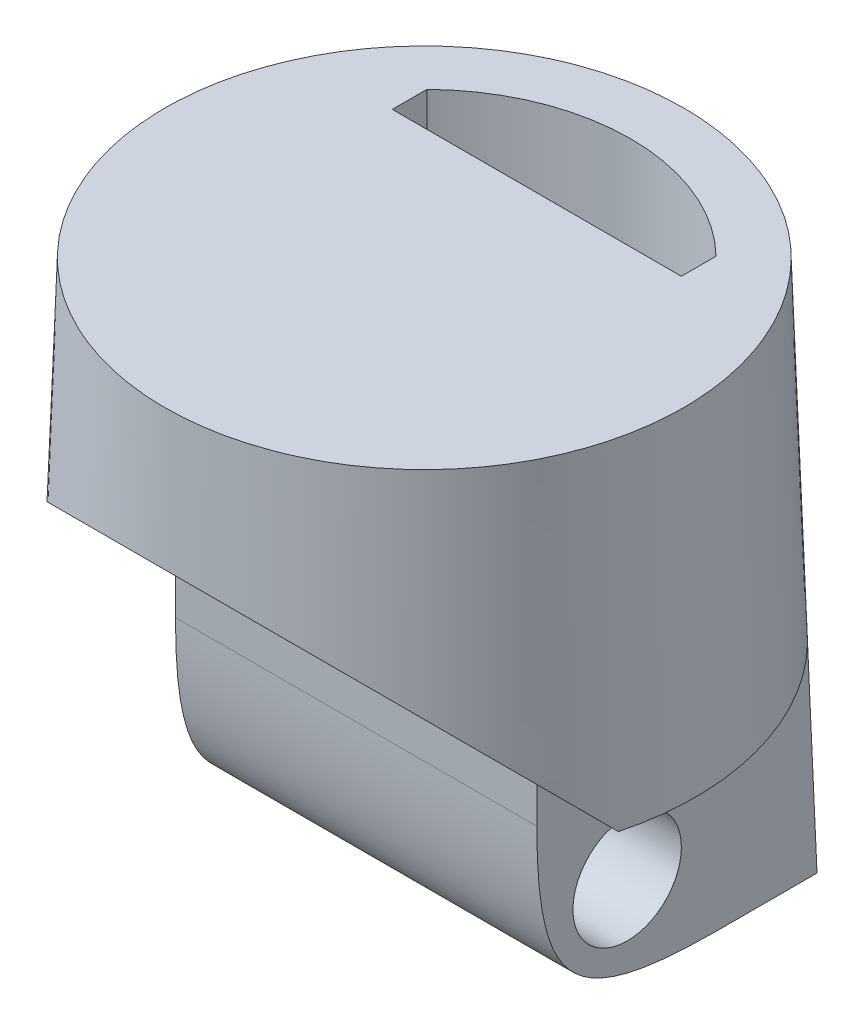
ISO-10303-21;
HEADER;
FILE_DESCRIPTION(('STEP AP214'),'2;1');
FILE_NAME('part.step','',(''),(''),'','','');
FILE_SCHEMA(('AUTOMOTIVE_DESIGN { 1 0 10303 214 1 1 1 1 }'));
ENDSEC;
DATA;
#1=APPLICATION_CONTEXT('core data for automotive mechanical design processes');
#2=APPLICATION_PROTOCOL_DEFINITION('international standard','automotive_design',2000,#1);
#3=PRODUCT_CONTEXT('',#1,'mechanical');
#4=PRODUCT('Part','Part','',(#3));
#5=PRODUCT_RELATED_PRODUCT_CATEGORY('part','',(#4));
#6=PRODUCT_DEFINITION_FORMATION('','',#4);
#7=PRODUCT_DEFINITION_CONTEXT('part definition',#1,'design');
#8=PRODUCT_DEFINITION('design','',#6,#7);
#9=PRODUCT_DEFINITION_SHAPE('','',#8);
#10=(LENGTH_UNIT() NAMED_UNIT(*) SI_UNIT(.MILLI.,.METRE.));
#11=(NAMED_UNIT(*) PLANE_ANGLE_UNIT() SI_UNIT($,.RADIAN.));
#12=(NAMED_UNIT(*) SI_UNIT($,.STERADIAN.) SOLID_ANGLE_UNIT());
#13=UNCERTAINTY_MEASURE_WITH_UNIT(LENGTH_MEASURE(1.E-05),#10,'distance_accuracy_value','');
#14=(GEOMETRIC_REPRESENTATION_CONTEXT(3) GLOBAL_UNCERTAINTY_ASSIGNED_CONTEXT((#13)) GLOBAL_UNIT_ASSIGNED_CONTEXT((#10,
#11,#12)) REPRESENTATION_CONTEXT('',''));
#15=CARTESIAN_POINT('',(0.,0.,0.));
#16=DIRECTION('',(0.,0.,1.));
#17=DIRECTION('',(1.,0.,0.));
#18=AXIS2_PLACEMENT_3D('',#15,#16,#17);
#19=CARTESIAN_POINT('',(0.,0.,0.));
#20=DIRECTION('',(0.,-1.,0.));
#21=DIRECTION('',(0.,0.,1.));
#22=AXIS2_PLACEMENT_3D('',#19,#20,#21);
#23=CONICAL_SURFACE('',#22,7.5,0.0349065850398867);
#24=CARTESIAN_POINT('',(0.,9.17972052923557,7.17943660421114));
#25=CARTESIAN_POINT('',(0.118571986620422,9.17972052923557,7.17944575688096));
#26=CARTESIAN_POINT('',(0.237150148904461,9.17972052923557,7.17661159384998));
#27=CARTESIAN_POINT('',(0.473168276274172,9.17972052923557,7.16520025098081));
#28=CARTESIAN_POINT('',(0.590610266603891,9.17972052923557,7.15666479635592));
#29=CARTESIAN_POINT('',(0.824357588198075,9.17972052923557,7.13385306660413));
#30=CARTESIAN_POINT('',(0.940665669416341,9.17972052923557,7.11960507988348));
#31=CARTESIAN_POINT('',(1.17214373783034,9.17972052923557,7.08538503356702));
#32=CARTESIAN_POINT('',(1.28731582557105,9.17972052923557,7.06542718945532));
#33=CARTESIAN_POINT('',(1.51652306444661,9.17972052923557,7.01980095339681));
#34=CARTESIAN_POINT('',(1.63055821826484,9.17972052923557,6.99413257493124));
#35=CARTESIAN_POINT('',(1.85749383923273,9.17972052923557,6.93709979430193));
#36=CARTESIAN_POINT('',(1.97039080849767,9.17972052923557,6.90572148122746));
#37=CARTESIAN_POINT('',(2.19505402212736,9.17972052923557,6.83728255298423));
#38=CARTESIAN_POINT('',(2.30681198965208,9.17972052923557,6.80019478638637));
#39=CARTESIAN_POINT('',(2.52920149877125,9.17972052923557,6.72035035257049));
#40=CARTESIAN_POINT('',(2.63981889533839,9.17972052923557,6.67755434103237));
#41=CARTESIAN_POINT('',(2.85877066945721,9.17972052923557,6.58678704588119));
#42=CARTESIAN_POINT('',(2.96710736633239,9.17972052923557,6.53882135688651));
#43=CARTESIAN_POINT('',(3.18053785662165,9.17972052923557,6.4380215445995));
#44=CARTESIAN_POINT('',(3.28564942473153,9.17972052923557,6.38522509945655));
#45=CARTESIAN_POINT('',(3.49263214894268,9.17972052923557,6.27477676203941));
#46=CARTESIAN_POINT('',(3.59451662054921,9.17972052923557,6.21714983491524));
#47=CARTESIAN_POINT('',(3.79505015521465,9.17972052923557,6.09705342613454));
#48=CARTESIAN_POINT('',(3.89370657193165,9.17972052923557,6.03459622674424));
#49=CARTESIAN_POINT('',(4.08779023357298,9.17972052923557,5.9048520841139));
#50=CARTESIAN_POINT('',(4.18321749018605,9.17972052923557,5.83756515835898));
#51=CARTESIAN_POINT('',(4.37085043104281,9.17972052923557,5.69817384818337));
#52=CARTESIAN_POINT('',(4.46304760184633,9.17972052923557,5.62605800677962));
#53=CARTESIAN_POINT('',(4.64422924545667,9.17972052923557,5.47702003453976));
#54=CARTESIAN_POINT('',(4.73319576502738,9.17972052923557,5.40007608701432));
#55=CARTESIAN_POINT('',(4.90792516029448,9.17972052923557,5.2413925823977));
#56=CARTESIAN_POINT('',(4.99366004006575,9.17972052923557,5.15962222524138));
#57=CARTESIAN_POINT('',(5.16109139933468,9.17972052923557,4.99213934443687));
#58=CARTESIAN_POINT('',(5.24279014095672,9.17972052923557,4.90642908219755));
#59=CARTESIAN_POINT('',(5.40133520247751,9.17972052923557,4.73175393581947));
#60=CARTESIAN_POINT('',(5.47821227196413,9.17972052923557,4.64281698610851));
#61=CARTESIAN_POINT('',(5.62712125139827,9.17972052923557,4.46169948007634));
#62=CARTESIAN_POINT('',(5.69917494569587,9.17972052923557,4.36953684117684));
#63=CARTESIAN_POINT('',(5.83844670867451,9.17972052923557,4.18197793297614));
#64=CARTESIAN_POINT('',(5.90567622418996,9.17972052923557,4.08659016563577));
#65=CARTESIAN_POINT('',(6.03531026796964,9.17972052923557,3.89259042754518));
#66=CARTESIAN_POINT('',(6.09771479408689,9.17972052923557,3.79397845536029));
#67=CARTESIAN_POINT('',(6.21771055747554,9.17972052923557,3.59353873415331));
#68=CARTESIAN_POINT('',(6.27528955546774,9.17972052923557,3.49170365991481));
#69=CARTESIAN_POINT('',(6.38564668703645,9.17972052923557,3.28482463393058));
#70=CARTESIAN_POINT('',(6.43839992684702,9.17972052923557,3.17976740907891));
#71=CARTESIAN_POINT('',(6.53911803043368,9.17972052923557,2.96645050906933));
#72=CARTESIAN_POINT('',(6.58704531596966,9.17972052923557,2.85817311113509));
#73=CARTESIAN_POINT('',(6.67769042035987,9.17972052923557,2.63946506813732));
#74=CARTESIAN_POINT('',(6.72040847723779,9.17972052923557,2.52903452172457));
#75=CARTESIAN_POINT('',(6.80011682634982,9.17972052923557,2.30702078124153));
#76=CARTESIAN_POINT('',(6.83714617994259,9.17972052923557,2.19545163025105));
#77=CARTESIAN_POINT('',(6.90548812123625,9.17972052923557,1.97116810248607));
#78=CARTESIAN_POINT('',(6.93682765459777,9.17972052923557,1.85846194204957));
#79=CARTESIAN_POINT('',(6.99380256074083,9.17972052923557,1.63190996107888));
#80=CARTESIAN_POINT('',(7.01945172685572,9.17972052923557,1.51806761113758));
#81=CARTESIAN_POINT('',(7.0650593368191,9.17972052923557,1.28924789375931));
#82=CARTESIAN_POINT('',(7.08501774415206,9.17972052923557,1.17427051904419));
#83=CARTESIAN_POINT('',(7.11925787129437,9.17972052923557,0.943184063767979));
#84=CARTESIAN_POINT('',(7.13352544838553,9.17972052923557,0.827072889404231));
#85=CARTESIAN_POINT('',(7.15639801135268,9.17972052923557,0.593720455221635));
#86=CARTESIAN_POINT('',(7.16497488944396,9.17972052923557,0.476476445839451));
#87=CARTESIAN_POINT('',(7.1764801267446,9.17972052923557,0.240859512663083));
#88=CARTESIAN_POINT('',(7.17936695954511,9.17972052923557,0.122484579181454));
#89=CARTESIAN_POINT('',(7.17950390215796,9.17972052923557,-0.114326502463611));
#90=CARTESIAN_POINT('',(7.17675125318071,9.17972052923557,-0.232762652238235));
#91=CARTESIAN_POINT('',(7.16550635438694,9.17972052923557,-0.468508694929806));
#92=CARTESIAN_POINT('',(7.15705563549996,9.17972052923557,-0.585820550827227));
#93=CARTESIAN_POINT('',(7.13442770539744,9.17972052923557,-0.819315355902035));
#94=CARTESIAN_POINT('',(7.12027857169404,9.17972052923557,-0.935501020606977));
#95=CARTESIAN_POINT('',(7.08626759759947,9.17972052923557,-1.16674311791076));
#96=CARTESIAN_POINT('',(7.06641983612585,9.17972052923557,-1.28180161951618));
#97=CARTESIAN_POINT('',(7.02102583586315,9.17972052923557,-1.51079024309685));
#98=CARTESIAN_POINT('',(6.99547953614324,9.17972052923557,-1.62472035299333));
#99=CARTESIAN_POINT('',(6.93870272450762,9.17972052923557,-1.85145450647404));
#100=CARTESIAN_POINT('',(6.90745828995545,9.17972052923557,-1.96425506189737));
#101=CARTESIAN_POINT('',(6.83929887951573,9.17972052923557,-2.18873401140755));
#102=CARTESIAN_POINT('',(6.8023567995104,9.17972052923557,-2.30040417003664));
#103=CARTESIAN_POINT('',(6.72281558774612,9.17972052923557,-2.522626634042));
#104=CARTESIAN_POINT('',(6.68017721285027,9.17972052923557,-2.63316487363385));
#105=CARTESIAN_POINT('',(6.58964238439755,9.17972052923557,-2.85219075158521));
#106=CARTESIAN_POINT('',(6.54174093276102,9.17972052923557,-2.96067632403284));
#107=CARTESIAN_POINT('',(6.44105643145445,9.17972052923557,-3.17440354290565));
#108=CARTESIAN_POINT('',(6.38831115946459,9.17972052923557,-3.27966296598176));
#109=CARTESIAN_POINT('',(6.27795220142437,9.17972052923557,-3.4869404693166));
#110=CARTESIAN_POINT('',(6.22036352361327,9.17972052923557,-3.58897185828626));
#111=CARTESIAN_POINT('',(6.10033066636842,9.17972052923557,-3.78979828318747));
#112=CARTESIAN_POINT('',(6.03789875681905,9.17972052923557,-3.88860065077187));
#113=CARTESIAN_POINT('',(5.90819231054502,9.17972052923557,-4.08297529079225));
#114=CARTESIAN_POINT('',(5.84091772555856,9.17972052923557,-4.17854753102304));
#115=CARTESIAN_POINT('',(5.70153827251643,9.17972052923557,-4.3664695441047));
#116=CARTESIAN_POINT('',(5.62942183294298,9.17972052923557,-4.45881073234718));
#117=CARTESIAN_POINT('',(5.48036985581629,9.17972052923557,-4.64027951834643));
#118=CARTESIAN_POINT('',(5.40341234450332,9.17972052923557,-4.72938906048293));
#119=CARTESIAN_POINT('',(5.24468906589856,9.17972052923557,-4.90440373772111));
#120=CARTESIAN_POINT('',(5.16289230765666,9.17972052923557,-4.99028074209401));
#121=CARTESIAN_POINT('',(4.99528568204716,9.17972052923557,-5.15805208320369));
#122=CARTESIAN_POINT('',(4.90947518274602,9.17972052923557,-5.23994578863142));
#123=CARTESIAN_POINT('',(4.73458599241109,9.17972052923557,-5.39886482126665));
#124=CARTESIAN_POINT('',(4.64553543261101,9.17972052923557,-5.47592107962439));
#125=CARTESIAN_POINT('',(4.46417732254241,9.17972052923557,-5.62517264106287));
#126=CARTESIAN_POINT('',(4.37188780966589,9.17972052923557,-5.6973898530503));
#127=CARTESIAN_POINT('',(4.18406181908893,9.17972052923557,-5.83697288572068));
#128=CARTESIAN_POINT('',(4.08853389158672,9.17972052923557,-5.90435020885669));
#129=CARTESIAN_POINT('',(3.89424057779066,9.17972052923557,-6.03426418095637));
#130=CARTESIAN_POINT('',(3.79547517419918,9.17972052923557,-6.0968008040505));
#131=CARTESIAN_POINT('',(3.59471539770186,9.17972052923557,-6.2170451599735));
#132=CARTESIAN_POINT('',(3.49271363033662,9.17972052923557,-6.2747405436685));
#133=CARTESIAN_POINT('',(3.28548807026669,9.17972052923557,-6.38531491054845));
#134=CARTESIAN_POINT('',(3.18025089454479,9.17972052923557,-6.43816880105669));
#135=CARTESIAN_POINT('',(2.9665610091424,9.17972052923557,-6.53907284328232));
#136=CARTESIAN_POINT('',(2.85809044008001,9.17972052923557,-6.58708513079815));
#137=CARTESIAN_POINT('',(2.6391074382761,9.17972052923557,-6.67783308404255));
#138=CARTESIAN_POINT('',(2.52859744613179,9.17972052923557,-6.720574639261));
#139=CARTESIAN_POINT('',(2.3064244918737,9.17972052923557,-6.80032174483798));
#140=CARTESIAN_POINT('',(2.19477561373425,9.17972052923557,-6.83736647890906));
#141=CARTESIAN_POINT('',(1.97033237861649,9.17972052923557,-6.90573104432168));
#142=CARTESIAN_POINT('',(1.85754626238863,9.17972052923557,-6.93707791170071));
#143=CARTESIAN_POINT('',(1.6308341194418,9.17972052923557,-6.99405936235434));
#144=CARTESIAN_POINT('',(1.51691157505327,9.17972052923557,-7.01970779376338));
#145=CARTESIAN_POINT('',(1.28793123455489,9.17972052923557,-7.06530585304984));
#146=CARTESIAN_POINT('',(1.17287343442936,9.17972052923557,-7.08525546076164));
#147=CARTESIAN_POINT('',(0.941625899919124,9.17972052923557,-7.11946994543763));
#148=CARTESIAN_POINT('',(0.825434071326852,9.17972052923557,-7.13372065647026));
#149=CARTESIAN_POINT('',(0.591920107124864,9.17972052923557,-7.15655148369973));
#150=CARTESIAN_POINT('',(0.474595222842914,9.17972052923557,-7.16510342996532));
#151=CARTESIAN_POINT('',(0.238816301573253,9.17972052923557,-7.17655084073244));
#152=CARTESIAN_POINT('',(0.120360261657387,9.17972052923557,-7.17940468007261));
#153=CARTESIAN_POINT('',(-0.116474183113576,9.17972052923557,-7.17946799615174));
#154=CARTESIAN_POINT('',(-0.234852586972706,9.17972052923557,-7.17668124192976));
#155=CARTESIAN_POINT('',(-0.470482635055381,9.17972052923557,-7.16537410010889));
#156=CARTESIAN_POINT('',(-0.58773625111208,9.17972052923557,-7.15689518003769));
#157=CARTESIAN_POINT('',(-0.821114066107866,9.17972052923557,-7.13421679181642));
#158=CARTESIAN_POINT('',(-0.937240984457153,9.17972052923557,-7.12004536433122));
#159=CARTESIAN_POINT('',(-1.16836508753831,9.17972052923557,-7.08599571911205));
#160=CARTESIAN_POINT('',(-1.28336434340844,9.17972052923557,-7.06613157160929));
#161=CARTESIAN_POINT('',(-1.51223397331208,9.17972052923557,-7.02071068611827));
#162=CARTESIAN_POINT('',(-1.62610433919306,9.17972052923557,-6.99515390705073));
#163=CARTESIAN_POINT('',(-1.85271850316021,9.17972052923557,-6.93836199852464));
#164=CARTESIAN_POINT('',(-1.96545882223409,9.17972052923557,-6.90711299394438));
#165=CARTESIAN_POINT('',(-2.18981678082368,9.17972052923557,-6.83895026397964));
#166=CARTESIAN_POINT('',(-2.3014262022402,9.17972052923557,-6.80200950752361));
#167=CARTESIAN_POINT('',(-2.52352670541981,9.17972052923557,-6.72247679080624));
#168=CARTESIAN_POINT('',(-2.63400374972533,9.17972052923557,-6.67984568333587));
#169=CARTESIAN_POINT('',(-2.85278707024791,9.17972052923557,-6.58938056924668));
#170=CARTESIAN_POINT('',(-2.96109367304929,9.17972052923557,-6.54154735245239));
#171=CARTESIAN_POINT('',(-3.17447456902647,9.17972052923557,-6.44101415704551));
#172=CARTESIAN_POINT('',(-3.27956652088802,9.17972052923557,-6.38835170101979));
#173=CARTESIAN_POINT('',(-3.48652070032621,9.17972052923557,-6.27817319553649));
#174=CARTESIAN_POINT('',(-3.58839614237666,9.17972052923557,-6.22068197900119));
#175=CARTESIAN_POINT('',(-3.7889222614934,9.17972052923557,-6.10085876571368));
#176=CARTESIAN_POINT('',(-3.88758021228873,9.17972052923557,-6.03853894495793));
#177=CARTESIAN_POINT('',(-4.08167756677672,9.17972052923557,-5.90907131726749));
#178=CARTESIAN_POINT('',(-4.17711692817054,9.17972052923557,-5.84192344691868));
#179=CARTESIAN_POINT('',(-4.36478468871234,9.17972052923557,-5.70281199167918));
#180=CARTESIAN_POINT('',(-4.45700455068445,9.17972052923557,-5.63083689262271));
#181=CARTESIAN_POINT('',(-4.63824210117091,9.17972052923557,-5.482082065508));
#182=CARTESIAN_POINT('',(-4.72724184590167,9.17972052923557,-5.40528048403288));
#183=CARTESIAN_POINT('',(-4.90204838817401,9.17972052923557,-5.24688358054211));
#184=CARTESIAN_POINT('',(-4.98782723593332,9.17972052923557,-5.16525744005167));
#185=CARTESIAN_POINT('',(-5.15543546332505,9.17972052923557,-4.99798314136094));
#186=CARTESIAN_POINT('',(-5.23726330746856,9.17972052923557,-4.91233344458507));
#187=CARTESIAN_POINT('',(-5.39606671961261,9.17972052923557,-4.7377696396511));
#188=CARTESIAN_POINT('',(-5.47307299370363,9.17972052923557,-4.6488834896088));
#189=CARTESIAN_POINT('',(-5.62224076822354,9.17972052923557,-4.46785803125586));
#190=CARTESIAN_POINT('',(-5.69442399740929,9.17972052923557,-4.37573663477426));
#191=CARTESIAN_POINT('',(-5.83395516665944,9.17972052923557,-4.18825063300932));
#192=CARTESIAN_POINT('',(-5.90131448511901,9.17972052923557,-4.09289449788013));
#193=CARTESIAN_POINT('',(-6.03120849677844,9.17972052923557,-3.89894848456029));
#194=CARTESIAN_POINT('',(-6.09374310441139,9.17972052923557,-3.80035854906192));
#195=CARTESIAN_POINT('',(-6.2139994194861,9.17972052923557,-3.59995338915572));
#196=CARTESIAN_POINT('',(-6.27170878836044,9.17972052923557,-3.49813076280682));
#197=CARTESIAN_POINT('',(-6.38232700729846,9.17972052923557,-3.29126711118897));
#198=CARTESIAN_POINT('',(-6.43521084815808,9.17972052923557,-3.18621271875145));
#199=CARTESIAN_POINT('',(-6.53619073981498,9.17972052923557,-2.97289209191917));
#200=CARTESIAN_POINT('',(-6.58424908348822,9.17972052923557,-2.86460802813096));
#201=CARTESIAN_POINT('',(-6.67519508389612,9.17972052923557,-2.64578003942749));
#202=CARTESIAN_POINT('',(-6.7180782365785,9.17972052923557,-2.53523424254833));
#203=CARTESIAN_POINT('',(-6.79810103862543,9.17972052923557,-2.31298131294153));
#204=CARTESIAN_POINT('',(-6.83527990725004,9.17972052923557,-2.20128832042193));
#205=CARTESIAN_POINT('',(-6.90390543923081,9.17972052923557,-1.97674855892634));
#206=CARTESIAN_POINT('',(-6.9353791379682,9.17972052923557,-1.86391005839968));
#207=CARTESIAN_POINT('',(-6.99260694252804,9.17972052923557,-1.63708486778669));
#208=CARTESIAN_POINT('',(-7.01837485703721,9.17972052923557,-1.5231016633732));
#209=CARTESIAN_POINT('',(-7.06420462218736,9.17972052923557,-1.29399174984942));
#210=CARTESIAN_POINT('',(-7.08426637203618,9.17972052923557,-1.17886502057739));
#211=CARTESIAN_POINT('',(-7.11869793010649,9.17972052923557,-0.947471394108136));
#212=CARTESIAN_POINT('',(-7.13305345034384,9.17972052923557,-0.831202372603955));
#213=CARTESIAN_POINT('',(-7.15608668548741,9.17972052923557,-0.597525796475624));
#214=CARTESIAN_POINT('',(-7.16473606839006,9.17972052923557,-0.480115454778891));
#215=CARTESIAN_POINT('',(-7.17637133673631,9.17972052923557,-0.244157419732523));
#216=CARTESIAN_POINT('',(-7.17931539950482,9.17972052923557,-0.125607682329159));
#217=CARTESIAN_POINT('',(-7.17955082716567,9.17972052923557,0.111536230900909));
#218=CARTESIAN_POINT('',(-7.17684034221797,9.17972052923557,0.230130408576172));
#219=CARTESIAN_POINT('',(-7.1656640560787,9.17972052923557,0.466190696508077));
#220=CARTESIAN_POINT('',(-7.15723999464481,9.17972052923557,0.583658764732673));
#221=CARTESIAN_POINT('',(-7.13464989028277,9.17972052923557,0.817464160693207));
#222=CARTESIAN_POINT('',(-7.12051206211565,9.17972052923557,0.933804209029186));
#223=CARTESIAN_POINT('',(-7.08650824172408,9.17972052923557,1.16535323305195));
#224=CARTESIAN_POINT('',(-7.06665639069569,9.17972052923557,1.28056428369485));
#225=CARTESIAN_POINT('',(-7.02123883945266,9.17972052923557,1.50985616351061));
#226=CARTESIAN_POINT('',(-6.9956730640128,9.17972052923557,1.62393697778298));
#227=CARTESIAN_POINT('',(-6.93884201362635,9.17972052923557,1.8509707149856));
#228=CARTESIAN_POINT('',(-6.90756272722368,9.17972052923557,1.96392012878352));
#229=CARTESIAN_POINT('',(-6.83931836205118,9.17972052923557,2.18869496704881));
#230=CARTESIAN_POINT('',(-6.80232602087802,9.17972052923557,2.30051210848359));
#231=CARTESIAN_POINT('',(-6.72266924814017,9.17972052923557,2.52302682413097));
#232=CARTESIAN_POINT('',(-6.6799653548647,9.17972052923557,2.63371025240658));
#233=CARTESIAN_POINT('',(-6.58938272504132,9.17972052923557,2.85278592777606));
#234=CARTESIAN_POINT('',(-6.54151015568385,9.17972052923557,2.96118072489237));
#235=CARTESIAN_POINT('',(-6.44089087441144,9.17972052923557,3.17473184517354));
#236=CARTESIAN_POINT('',(-6.38818181681881,9.17972052923557,3.27990588989539));
#237=CARTESIAN_POINT('',(-6.27790286898899,9.17972052923557,3.48701812153658));
#238=CARTESIAN_POINT('',(-6.2203579027169,9.17972052923557,3.58896957334552));
#239=CARTESIAN_POINT('',(-6.10041996508461,9.17972052923557,3.78964158608419));
#240=CARTESIAN_POINT('',(-6.0380392202657,9.17972052923557,3.88836945260447));
#241=CARTESIAN_POINT('',(-5.90844256824603,9.17972052923557,4.08260053403309));
#242=CARTESIAN_POINT('',(-5.84122660882849,9.17972052923557,4.1781037141008));
#243=CARTESIAN_POINT('',(-5.70197183637233,9.17972052923557,4.36589303369241));
#244=CARTESIAN_POINT('',(-5.62992148413815,9.17972052923557,4.45817061421202));
#245=CARTESIAN_POINT('',(-5.4810090492501,9.17972052923557,4.63951755011736));
#246=CARTESIAN_POINT('',(-5.40412505661035,9.17972052923557,4.72856890703635));
#247=CARTESIAN_POINT('',(-5.24555625404904,9.17972052923557,4.90347266934843));
#248=CARTESIAN_POINT('',(-5.16384054335484,9.17972052923557,4.98929703558396));
#249=CARTESIAN_POINT('',(-4.99647864304331,9.17972052923557,5.15689203231409));
#250=CARTESIAN_POINT('',(-4.91083552327025,9.17972052923557,5.23866572839451));
#251=CARTESIAN_POINT('',(-4.73628872164389,9.17972052923557,5.3973634377635));
#252=CARTESIAN_POINT('',(-4.64741296147195,9.17972052923557,5.47431813443666));
#253=CARTESIAN_POINT('',(-4.46641212923118,9.17972052923557,5.62338533172849));
#254=CARTESIAN_POINT('',(-4.37430494981208,9.17972052923557,5.69551954955657));
#255=CARTESIAN_POINT('',(-4.18685120652335,9.17972052923557,5.83495526230484));
#256=CARTESIAN_POINT('',(-4.09151311005545,9.17972052923557,5.90226813774776));
#257=CARTESIAN_POINT('',(-3.89760698466305,9.17972052923557,6.03207182024845));
#258=CARTESIAN_POINT('',(-3.79903891038917,9.17972052923557,6.09456255956132));
#259=CARTESIAN_POINT('',(-3.59868126286174,9.17972052923557,6.21473365863163));
#260=CARTESIAN_POINT('',(-3.49688431201657,9.17972052923557,6.27240171459605));
#261=CARTESIAN_POINT('',(-3.29007581186927,9.17972052923557,6.38293988712643));
#262=CARTESIAN_POINT('',(-3.18505092951788,9.17972052923557,6.43578504706089));
#263=CARTESIAN_POINT('',(-2.97179303031997,9.17972052923557,6.53668985334317));
#264=CARTESIAN_POINT('',(-2.86354222435917,9.17972052923557,6.58471186029137));
#265=CARTESIAN_POINT('',(-2.64450365841352,9.17972052923557,6.67570547789619));
#266=CARTESIAN_POINT('',(-2.53370848402483,9.17972052923557,6.71865924203826));
#267=CARTESIAN_POINT('',(-2.31095619488408,9.17972052923557,6.79879784385399));
#268=CARTESIAN_POINT('',(-2.19901334707205,9.17972052923557,6.83602228416669));
#269=CARTESIAN_POINT('',(-1.97397319591022,9.17972052923557,6.90471334247082));
#270=CARTESIAN_POINT('',(-1.86088423806214,9.17972052923557,6.93620728224078));
#271=CARTESIAN_POINT('',(-1.63355751954557,9.17972052923557,6.99345018043331));
#272=CARTESIAN_POINT('',(-1.51932328165404,9.17972052923557,7.01921312139573));
#273=CARTESIAN_POINT('',(-1.28971079656563,9.17972052923557,7.06500745017738));
#274=CARTESIAN_POINT('',(-1.17433253986545,9.17972052923557,7.08503879034317));
#275=CARTESIAN_POINT('',(-0.942435082941599,9.17972052923557,7.11938490860749));
#276=CARTESIAN_POINT('',(-0.825913757188445,9.17972052923557,7.1336853289187));
#277=CARTESIAN_POINT('',(-0.591732920553798,9.17972052923557,7.1565810945786));
#278=CARTESIAN_POINT('',(-0.4740706305876,9.17972052923557,7.16514790342158));
#279=CARTESIAN_POINT('',(-0.237604844548052,9.17972052923557,7.17660130198725));
#280=CARTESIAN_POINT('',(-0.118799302761773,9.17972052923557,7.17944582067969));
#281=CARTESIAN_POINT('',(0.,9.17972052923557,7.17943660421114));
#282=B_SPLINE_CURVE_WITH_KNOTS('',3,(#24,#25,#26,#27,#28,#29,#30,#31,#32,#33,#34,#35,#36,#37,
#38,#39,#40,#41,#42,#43,#44,#45,#46,#47,#48,#49,#50,#51,#52,#53,#54,#55,#56,#57,#58,#59,#60,#61,
#62,#63,#64,#65,#66,#67,#68,#69,#70,#71,#72,#73,#74,#75,#76,#77,#78,#79,#80,#81,#82,#83,#84,#85,
#86,#87,#88,#89,#90,#91,#92,#93,#94,#95,#96,#97,#98,#99,#100,#101,#102,#103,#104,#105,#106,#107,
#108,#109,#110,#111,#112,#113,#114,#115,#116,#117,#118,#119,#120,#121,#122,#123,#124,#125,#126,
#127,#128,#129,#130,#131,#132,#133,#134,#135,#136,#137,#138,#139,#140,#141,#142,#143,#144,#145,
#146,#147,#148,#149,#150,#151,#152,#153,#154,#155,#156,#157,#158,#159,#160,#161,#162,#163,#164,
#165,#166,#167,#168,#169,#170,#171,#172,#173,#174,#175,#176,#177,#178,#179,#180,#181,#182,#183,
#184,#185,#186,#187,#188,#189,#190,#191,#192,#193,#194,#195,#196,#197,#198,#199,#200,#201,#202,
#203,#204,#205,#206,#207,#208,#209,#210,#211,#212,#213,#214,#215,#216,#217,#218,#219,#220,#221,
#222,#223,#224,#225,#226,#227,#228,#229,#230,#231,#232,#233,#234,#235,#236,#237,#238,#239,#240,
#241,#242,#243,#244,#245,#246,#247,#248,#249,#250,#251,#252,#253,#254,#255,#256,#257,#258,#259,
#260,#261,#262,#263,#264,#265,#266,#267,#268,#269,#270,#271,#272,#273,#274,#275,#276,#277,#278,
#279,#280,#281),.UNSPECIFIED.,.F.,.F.,(4,2,2,2,2,2,2,2,2,2,2,2,2,2,2,2,2,2,2,2,2,2,2,2,2,2,2,2,
2,2,2,2,2,2,2,2,2,2,2,2,2,2,2,2,2,2,2,2,2,2,2,2,2,2,2,2,2,2,2,2,2,2,2,2,2,2,2,2,2,2,2,2,2,2,2,2,
2,2,2,2,2,2,2,2,2,2,2,2,2,2,2,2,2,2,2,2,2,2,2,2,2,2,2,2,2,2,2,2,2,2,2,2,2,2,2,2,2,2,2,2,2,2,2,2,
2,2,2,2,4),(0.,0.355690738878376,0.70880644828016,1.0601947129203,1.41071564899302,
1.76123575757708,2.11262154587288,2.46573314821518,2.82141817882406,3.1767220807853,
3.52945892019192,3.88047353346112,4.23062322332355,4.58077164559796,4.93178246545974,
5.28451301336717,5.63980817083824,5.99490188368603,6.34743434032627,6.69824895618672,
7.0482015673408,7.39815433421307,7.74896941607997,8.10150264561265,8.4565974327047,
8.81167598847517,9.16419548121587,9.51499930760005,9.86494326925523,10.2148894763237,
10.5657000223934,10.9182306600342,11.2733247061214,11.6285925028662,11.9812984921629,
12.3322874669768,12.6824166489501,13.0325495748096,13.3835497536497,13.7362743252262,
14.0915679493108,14.4472019427833,14.8002659926349,15.1516074649721,15.5020862203517,
15.8525684690647,16.2039203955647,16.5570017838448,16.9126598754808,17.2683741525569,
17.6215153024755,17.9729311901636,18.3234821992578,18.6740350816281,19.0254565752832,
19.3786070227859,19.7343342222567,20.089660261208,20.4424209984308,20.7934615319571,
21.1436394143454,21.4938185358429,21.8448627775487,22.1976296649121,22.55296425187,
22.9080614829914,23.2605994985054,23.611421838383,23.9613844490634,24.3113495852321,
24.6621794829536,25.0147300334841,25.3698446870336,25.7249054993988,26.0774097315342,
26.4282007542041,26.77813432535,27.1280724935461,27.4788772734774,27.8314043226542,
28.1864968484789,28.5417262820441,28.8943969364434,29.2453534380438,29.5954528197834,
29.9455584091579,30.2965334878541,30.6492349530596,31.0045072103331,31.3600864704019,
31.7130993782948,32.0643930272712,32.4148269785481,32.7652671194109,33.1165792913785,
33.4696229200442,33.825244878076,34.1809831932295,34.5341503100954,34.8855943790771,
35.2361760563361,35.5867623493611,35.9382202314813,36.2914102576315,36.6471804135742,
37.002530665345,37.3553173639878,37.7063858854146,38.0565940484064,38.4068059939582,
38.7578858351339,39.1106913079437,39.4660676536687,39.8211708041323,40.1737167460955,
40.5245491618725,40.8745241263553,41.2245040066473,41.5753511336034,41.9279214746945,
42.2830585375032,42.6394109926811,42.9931774217214,43.3452102504225,43.6963745293769,
44.0475417278827,44.3995832935566,44.7533642127433,45.1097368067537),.UNSPECIFIED.);
#283=CARTESIAN_POINT('',(0.,9.17972052923557,7.17943660421114));
#284=VERTEX_POINT('',#283);
#285=EDGE_CURVE('E484',#284,#284,#282,.T.);
#286=ORIENTED_EDGE('',*,*,#285,.F.);
#287=EDGE_LOOP('',(#286));
#288=FACE_BOUND('',#287,.T.);
#289=CARTESIAN_POINT('',(0.,0.,0.));
#290=DIRECTION('',(0.,1.,0.));
#291=DIRECTION('',(0.,0.,1.));
#292=AXIS2_PLACEMENT_3D('',#289,#290,#291);
#293=CIRCLE('',#292,7.5);
#294=CARTESIAN_POINT('',(5.,0.,-5.59016994374947));
#295=VERTEX_POINT('',#294);
#296=CARTESIAN_POINT('',(7.25897968705128,0.,1.88605776766695));
#297=VERTEX_POINT('',#296);
#298=EDGE_CURVE('E263',#295,#297,#293,.F.);
#299=ORIENTED_EDGE('',*,*,#298,.F.);
#300=CARTESIAN_POINT('',(5.,10.252149099376,-5.09980188140345));
#301=CARTESIAN_POINT('',(5.,7.78842746482874,-5.22025588342328));
#302=CARTESIAN_POINT('',(5.,5.32460805247971,-5.33869034091386));
#303=CARTESIAN_POINT('',(5.,0.39681009901759,-5.57213129808216));
#304=CARTESIAN_POINT('',(5.,-2.06716844187149,-5.68713780248422));
#305=CARTESIAN_POINT('',(5.,-6.99525392424198,-5.91433426300344));
#306=CARTESIAN_POINT('',(5.,-9.45936086566596,-6.02652422036962));
#307=CARTESIAN_POINT('',(5.,-14.3876865259722,-6.24849928183551));
#308=CARTESIAN_POINT('',(5.,-16.8519052450034,-6.35828438262923));
#309=CARTESIAN_POINT('',(5.,-19.3161676076941,-6.4670727228374));
#310=B_SPLINE_CURVE_WITH_KNOTS('',3,(#300,#301,#302,#303,#304,#305,#306,#307,#308,#309),
.UNSPECIFIED.,.F.,.F.,(4,2,2,2,4),(0.,7.39999111466669,14.7999720303665,22.199949664437,
29.5999374707321),.UNSPECIFIED.);
#311=CARTESIAN_POINT('',(5.,-6.,-5.86828508334126));
#312=VERTEX_POINT('',#311);
#313=EDGE_CURVE('E207',#295,#312,#310,.T.);
#314=ORIENTED_EDGE('',*,*,#313,.T.);
#315=CARTESIAN_POINT('',(0.,-6.,0.));
#316=DIRECTION('',(0.,1.,0.));
#317=DIRECTION('',(0.,0.,1.));
#318=AXIS2_PLACEMENT_3D('',#315,#316,#317);
#319=CIRCLE('',#318,7.70952461695049);
#320=CARTESIAN_POINT('',(-5.,-6.,-5.86828508334126));
#321=VERTEX_POINT('',#320);
#322=EDGE_CURVE('E303',#312,#321,#319,.T.);
#323=ORIENTED_EDGE('',*,*,#322,.T.);
#324=CARTESIAN_POINT('',(-5.,10.252149099376,-5.09980188140345));
#325=CARTESIAN_POINT('',(-5.,7.78842746482874,-5.22025588342328));
#326=CARTESIAN_POINT('',(-5.,5.32460805247971,-5.33869034091386));
#327=CARTESIAN_POINT('',(-5.,0.39681009901759,-5.57213129808216));
#328=CARTESIAN_POINT('',(-5.,-2.06716844187149,-5.68713780248422));
#329=CARTESIAN_POINT('',(-5.,-6.99525392424198,-5.91433426300343));
#330=CARTESIAN_POINT('',(-5.,-9.45936086566596,-6.02652422036962));
#331=CARTESIAN_POINT('',(-5.,-14.3876865259722,-6.24849928183551));
#332=CARTESIAN_POINT('',(-5.,-16.8519052450034,-6.35828438262923));
#333=CARTESIAN_POINT('',(-5.,-19.3161676076941,-6.4670727228374));
#334=B_SPLINE_CURVE_WITH_KNOTS('',3,(#324,#325,#326,#327,#328,#329,#330,#331,#332,#333),
.UNSPECIFIED.,.F.,.F.,(4,2,2,2,4),(0.,7.39999111466669,14.7999720303665,22.199949664437,
29.5999374707321),.UNSPECIFIED.);
#335=CARTESIAN_POINT('',(-5.,0.,-5.59016994374947));
#336=VERTEX_POINT('',#335);
#337=EDGE_CURVE('E215',#336,#321,#334,.T.);
#338=ORIENTED_EDGE('',*,*,#337,.F.);
#339=CARTESIAN_POINT('',(0.,0.,0.));
#340=DIRECTION('',(0.,-1.,0.));
#341=DIRECTION('',(0.,0.,-1.));
#342=AXIS2_PLACEMENT_3D('',#339,#340,#341);
#343=CIRCLE('',#342,7.5);
#344=CARTESIAN_POINT('',(-7.25897968705128,0.,1.88605776766695));
#345=VERTEX_POINT('',#344);
#346=EDGE_CURVE('E223',#336,#345,#343,.F.);
#347=ORIENTED_EDGE('',*,*,#346,.T.);
#348=CARTESIAN_POINT('',(0.,-2.15058609287703,-0.264528325210086));
#349=DIRECTION('',(0.,0.707106781186549,-0.707106781186546));
#350=DIRECTION('',(0.,-0.707106781186546,-0.707106781186549));
#351=AXIS2_PLACEMENT_3D('',#348,#349,#350);
#352=ELLIPSE('',#351,10.7128093277655,7.57047994592759);
#353=EDGE_CURVE('E162',#297,#345,#352,.F.);
#354=ORIENTED_EDGE('',*,*,#353,.F.);
#355=EDGE_LOOP('',(#299,#314,#323,#338,#347,#354));
#356=FACE_BOUND('',#355,.T.);
#357=ADVANCED_FACE('F43',(#288,#356),#23,.T.);
#358=CARTESIAN_POINT('',(0.,-6.,0.));
#359=DIRECTION('',(0.,1.,0.));
#360=DIRECTION('',(0.,0.,1.));
#361=AXIS2_PLACEMENT_3D('',#358,#359,#360);
#362=PLANE('',#361);
#363=CARTESIAN_POINT('',(-5.5,-6.,-3.11394223233305));
#364=CARTESIAN_POINT('',(-1.83333333333334,-6.,-3.11394223233305));
#365=CARTESIAN_POINT('',(1.83333333333333,-6.,-3.11394223233305));
#366=CARTESIAN_POINT('',(5.5,-6.,-3.11394223233305));
#367=(BOUNDED_CURVE() B_SPLINE_CURVE(3,(#363,#364,#365,#366),.UNSPECIFIED.,.F.,
.F.) B_SPLINE_CURVE_WITH_KNOTS((4,4),(-0.0055,0.0055),
.UNSPECIFIED.) CURVE() GEOMETRIC_REPRESENTATION_ITEM() RATIONAL_B_SPLINE_CURVE((1.,1.,1.,1.)) REPRESENTATION_ITEM(''));
#368=CARTESIAN_POINT('',(5.,-6.,-3.11394223233305));
#369=VERTEX_POINT('',#368);
#370=CARTESIAN_POINT('',(4.,-6.,-3.11394223233305));
#371=VERTEX_POINT('',#370);
#372=EDGE_CURVE('E161',#369,#371,#367,.F.);
#373=ORIENTED_EDGE('',*,*,#372,.T.);
#374=DIRECTION('',(0.,0.,1.));
#375=VECTOR('',#374,1.);
#376=CARTESIAN_POINT('',(4.,-6.,-3.11394223233305));
#377=LINE('',#376,#375);
#378=CARTESIAN_POINT('',(4.,-6.,-4.07414670226338));
#379=VERTEX_POINT('',#378);
#380=EDGE_CURVE('E64',#379,#371,#377,.T.);
#381=ORIENTED_EDGE('',*,*,#380,.F.);
#382=CARTESIAN_POINT('',(0.,-6.,0.));
#383=DIRECTION('',(0.,-1.,0.));
#384=DIRECTION('',(0.,0.,-1.));
#385=AXIS2_PLACEMENT_3D('',#382,#383,#384);
#386=CIRCLE('',#385,5.70952461695049);
#387=CARTESIAN_POINT('',(-4.,-6.,-4.07414670226338));
#388=VERTEX_POINT('',#387);
#389=EDGE_CURVE('E154',#388,#379,#386,.T.);
#390=ORIENTED_EDGE('',*,*,#389,.F.);
#391=DIRECTION('',(0.,0.,-1.));
#392=VECTOR('',#391,1.);
#393=CARTESIAN_POINT('',(-4.,-6.,-3.11394223233305));
#394=LINE('',#393,#392);
#395=CARTESIAN_POINT('',(-4.,-6.,-3.11394223233305));
#396=VERTEX_POINT('',#395);
#397=EDGE_CURVE('E129',#396,#388,#394,.T.);
#398=ORIENTED_EDGE('',*,*,#397,.F.);
#399=CARTESIAN_POINT('',(-5.5,-6.,-3.11394223233305));
#400=CARTESIAN_POINT('',(-1.83333333333334,-6.,-3.11394223233305));
#401=CARTESIAN_POINT('',(1.83333333333333,-6.,-3.11394223233305));
#402=CARTESIAN_POINT('',(5.5,-6.,-3.11394223233305));
#403=(BOUNDED_CURVE() B_SPLINE_CURVE(3,(#399,#400,#401,#402),.UNSPECIFIED.,.F.,
.F.) B_SPLINE_CURVE_WITH_KNOTS((4,4),(-0.0055,0.0055),
.UNSPECIFIED.) CURVE() GEOMETRIC_REPRESENTATION_ITEM() RATIONAL_B_SPLINE_CURVE((1.,1.,1.,1.)) REPRESENTATION_ITEM(''));
#404=CARTESIAN_POINT('',(-5.,-6.,-3.11394223233305));
#405=VERTEX_POINT('',#404);
#406=EDGE_CURVE('E150',#396,#405,#403,.F.);
#407=ORIENTED_EDGE('',*,*,#406,.T.);
#408=DIRECTION('',(0.,0.,1.));
#409=VECTOR('',#408,1.);
#410=CARTESIAN_POINT('',(-5.,-6.,-7.70952461695049));
#411=LINE('',#410,#409);
#412=EDGE_CURVE('E270',#321,#405,#411,.T.);
#413=ORIENTED_EDGE('',*,*,#412,.F.);
#414=ORIENTED_EDGE('',*,*,#322,.F.);
#415=DIRECTION('',(0.,0.,1.));
#416=VECTOR('',#415,1.);
#417=CARTESIAN_POINT('',(5.,-6.,-7.70952461695049));
#418=LINE('',#417,#416);
#419=EDGE_CURVE('E253',#312,#369,#418,.T.);
#420=ORIENTED_EDGE('',*,*,#419,.T.);
#421=EDGE_LOOP('',(#373,#381,#390,#398,#407,#413,#414,#420));
#422=FACE_BOUND('',#421,.T.);
#423=ADVANCED_FACE('F148',(#422),#362,.F.);
#424=CARTESIAN_POINT('',(-7.70952461695049,-6.,1.88605776766695));
#425=DIRECTION('',(0.,0.,-1.));
#426=DIRECTION('',(-1.,0.,0.));
#427=AXIS2_PLACEMENT_3D('',#424,#425,#426);
#428=PLANE('',#427);
#429=DIRECTION('',(0.,1.,0.));
#430=VECTOR('',#429,1.);
#431=CARTESIAN_POINT('',(-5.,0.,1.88605776766695));
#432=LINE('',#431,#430);
#433=CARTESIAN_POINT('',(-5.,-1.,1.88605776766695));
#434=VERTEX_POINT('',#433);
#435=CARTESIAN_POINT('',(-5.,0.,1.88605776766695));
#436=VERTEX_POINT('',#435);
#437=EDGE_CURVE('E272',#434,#436,#432,.T.);
#438=ORIENTED_EDGE('',*,*,#437,.F.);
#439=CARTESIAN_POINT('',(5.5,-1.,1.88605776766695));
#440=CARTESIAN_POINT('',(1.83333333333333,-1.,1.88605776766695));
#441=CARTESIAN_POINT('',(-1.83333333333334,-1.,1.88605776766695));
#442=CARTESIAN_POINT('',(-5.5,-1.,1.88605776766695));
#443=(BOUNDED_CURVE() B_SPLINE_CURVE(3,(#439,#440,#441,#442),.UNSPECIFIED.,.F.,
.F.) B_SPLINE_CURVE_WITH_KNOTS((4,4),(-0.0055,0.0055),
.UNSPECIFIED.) CURVE() GEOMETRIC_REPRESENTATION_ITEM() RATIONAL_B_SPLINE_CURVE((1.,1.,1.,1.)) REPRESENTATION_ITEM(''));
#444=CARTESIAN_POINT('',(5.,-1.,1.88605776766695));
#445=VERTEX_POINT('',#444);
#446=EDGE_CURVE('E310',#434,#445,#443,.F.);
#447=ORIENTED_EDGE('',*,*,#446,.T.);
#448=DIRECTION('',(0.,1.,0.));
#449=VECTOR('',#448,1.);
#450=CARTESIAN_POINT('',(5.,0.,1.88605776766695));
#451=LINE('',#450,#449);
#452=CARTESIAN_POINT('',(5.,0.,1.88605776766695));
#453=VERTEX_POINT('',#452);
#454=EDGE_CURVE('E245',#445,#453,#451,.T.);
#455=ORIENTED_EDGE('',*,*,#454,.T.);
#456=DIRECTION('',(1.,0.,0.));
#457=VECTOR('',#456,1.);
#458=CARTESIAN_POINT('',(-7.70952461695049,0.,1.88605776766695));
#459=LINE('',#458,#457);
#460=EDGE_CURVE('E294',#436,#453,#459,.T.);
#461=ORIENTED_EDGE('',*,*,#460,.F.);
#462=EDGE_LOOP('',(#438,#447,#455,#461));
#463=FACE_BOUND('',#462,.T.);
#464=ADVANCED_FACE('F295',(#463),#428,.F.);
#465=CARTESIAN_POINT('',(-7.70952461695049,0.,1.88605776766695));
#466=DIRECTION('',(0.,0.707106781186549,-0.707106781186546));
#467=DIRECTION('',(0.,0.707106781186546,0.707106781186549));
#468=AXIS2_PLACEMENT_3D('',#465,#466,#467);
#469=PLANE('',#468);
#470=ORIENTED_EDGE('',*,*,#353,.T.);
#471=EDGE_CURVE('E287',#345,#436,#459,.T.);
#472=ORIENTED_EDGE('',*,*,#471,.T.);
#473=ORIENTED_EDGE('',*,*,#460,.T.);
#474=EDGE_CURVE('E299',#453,#297,#459,.T.);
#475=ORIENTED_EDGE('',*,*,#474,.T.);
#476=EDGE_LOOP('',(#470,#472,#473,#475));
#477=FACE_BOUND('',#476,.T.);
#478=ADVANCED_FACE('F301',(#477),#469,.F.);
#479=CARTESIAN_POINT('',(0.,0.,-7.70952461695049));
#480=DIRECTION('',(0.,-1.,0.));
#481=DIRECTION('',(0.,0.,-1.));
#482=AXIS2_PLACEMENT_3D('',#479,#480,#481);
#483=PLANE('',#482);
#484=DIRECTION('',(0.,0.,1.));
#485=VECTOR('',#484,1.);
#486=CARTESIAN_POINT('',(-5.,0.,-7.70952461695049));
#487=LINE('',#486,#485);
#488=EDGE_CURVE('E224',#336,#436,#487,.T.);
#489=ORIENTED_EDGE('',*,*,#488,.T.);
#490=ORIENTED_EDGE('',*,*,#471,.F.);
#491=ORIENTED_EDGE('',*,*,#346,.F.);
#492=EDGE_LOOP('',(#489,#490,#491));
#493=FACE_BOUND('',#492,.T.);
#494=ADVANCED_FACE('F233',(#493),#483,.T.);
#495=CARTESIAN_POINT('',(-5.,0.,-7.70952461695049));
#496=DIRECTION('',(1.,0.,0.));
#497=DIRECTION('',(0.,0.,-1.));
#498=AXIS2_PLACEMENT_3D('',#495,#496,#497);
#499=PLANE('',#498);
#500=CARTESIAN_POINT('',(-5.,-3.5,-0.613942232333046));
#501=DIRECTION('',(1.,0.,0.));
#502=DIRECTION('',(0.,0.,-1.));
#503=AXIS2_PLACEMENT_3D('',#500,#501,#502);
#504=CIRCLE('',#503,1.5);
#505=CARTESIAN_POINT('',(-5.,-3.5,-2.11394223233305));
#506=VERTEX_POINT('',#505);
#507=EDGE_CURVE('E254',#506,#506,#504,.T.);
#508=ORIENTED_EDGE('',*,*,#507,.T.);
#509=EDGE_LOOP('',(#508));
#510=FACE_BOUND('',#509,.T.);
#511=ORIENTED_EDGE('',*,*,#412,.T.);
#512=CARTESIAN_POINT('',(-5.,-1.,1.88605776766695));
#513=CARTESIAN_POINT('',(-5.,-6.,1.88605776766695));
#514=CARTESIAN_POINT('',(-5.,-6.,-3.11394223233305));
#515=(BOUNDED_CURVE() B_SPLINE_CURVE(2,(#512,#513,#514),.UNSPECIFIED.,.F.,
.F.) B_SPLINE_CURVE_WITH_KNOTS((3,3),(0.,1.),
.UNSPECIFIED.) CURVE() GEOMETRIC_REPRESENTATION_ITEM() RATIONAL_B_SPLINE_CURVE((1.,1.5,1.)) REPRESENTATION_ITEM(''));
#516=EDGE_CURVE('E158',#405,#434,#515,.F.);
#517=ORIENTED_EDGE('',*,*,#516,.T.);
#518=ORIENTED_EDGE('',*,*,#437,.T.);
#519=ORIENTED_EDGE('',*,*,#488,.F.);
#520=ORIENTED_EDGE('',*,*,#337,.T.);
#521=EDGE_LOOP('',(#511,#517,#518,#519,#520));
#522=FACE_BOUND('',#521,.T.);
#523=ADVANCED_FACE('F228',(#510,#522),#499,.F.);
#524=CARTESIAN_POINT('',(5.,0.,-7.70952461695049));
#525=DIRECTION('',(1.,0.,0.));
#526=DIRECTION('',(0.,0.,-1.));
#527=AXIS2_PLACEMENT_3D('',#524,#525,#526);
#528=PLANE('',#527);
#529=CARTESIAN_POINT('',(5.,-3.5,-0.613942232333046));
#530=DIRECTION('',(1.,0.,0.));
#531=DIRECTION('',(0.,0.,-1.));
#532=AXIS2_PLACEMENT_3D('',#529,#530,#531);
#533=CIRCLE('',#532,1.5);
#534=CARTESIAN_POINT('',(5.,-3.5,-2.11394223233305));
#535=VERTEX_POINT('',#534);
#536=EDGE_CURVE('E477',#535,#535,#533,.T.);
#537=ORIENTED_EDGE('',*,*,#536,.F.);
#538=EDGE_LOOP('',(#537));
#539=FACE_BOUND('',#538,.T.);
#540=ORIENTED_EDGE('',*,*,#454,.F.);
#541=CARTESIAN_POINT('',(5.,-6.,-3.11394223233305));
#542=CARTESIAN_POINT('',(5.,-6.,1.88605776766695));
#543=CARTESIAN_POINT('',(5.,-1.,1.88605776766695));
#544=(BOUNDED_CURVE() B_SPLINE_CURVE(2,(#541,#542,#543),.UNSPECIFIED.,.F.,
.F.) B_SPLINE_CURVE_WITH_KNOTS((3,3),(0.,1.),
.UNSPECIFIED.) CURVE() GEOMETRIC_REPRESENTATION_ITEM() RATIONAL_B_SPLINE_CURVE((1.,1.5,1.)) REPRESENTATION_ITEM(''));
#545=EDGE_CURVE('E187',#445,#369,#544,.F.);
#546=ORIENTED_EDGE('',*,*,#545,.T.);
#547=ORIENTED_EDGE('',*,*,#419,.F.);
#548=ORIENTED_EDGE('',*,*,#313,.F.);
#549=DIRECTION('',(0.,0.,1.));
#550=VECTOR('',#549,1.);
#551=CARTESIAN_POINT('',(5.,0.,-7.70952461695049));
#552=LINE('',#551,#550);
#553=EDGE_CURVE('E260',#295,#453,#552,.T.);
#554=ORIENTED_EDGE('',*,*,#553,.T.);
#555=EDGE_LOOP('',(#540,#546,#547,#548,#554));
#556=FACE_BOUND('',#555,.T.);
#557=ADVANCED_FACE('F232',(#539,#556),#528,.T.);
#558=CARTESIAN_POINT('',(0.,0.,-7.70952461695049));
#559=DIRECTION('',(0.,1.,0.));
#560=DIRECTION('',(0.,0.,1.));
#561=AXIS2_PLACEMENT_3D('',#558,#559,#560);
#562=PLANE('',#561);
#563=ORIENTED_EDGE('',*,*,#298,.T.);
#564=ORIENTED_EDGE('',*,*,#474,.F.);
#565=ORIENTED_EDGE('',*,*,#553,.F.);
#566=EDGE_LOOP('',(#563,#564,#565));
#567=FACE_BOUND('',#566,.T.);
#568=ADVANCED_FACE('F354',(#567),#562,.F.);
#569=CARTESIAN_POINT('',(-7.5,-3.5,-0.613942232333046));
#570=DIRECTION('',(1.,0.,0.));
#571=DIRECTION('',(0.,0.,-1.));
#572=AXIS2_PLACEMENT_3D('',#569,#570,#571);
#573=CYLINDRICAL_SURFACE('',#572,1.5);
#574=ORIENTED_EDGE('',*,*,#536,.T.);
#575=EDGE_LOOP('',(#574));
#576=FACE_BOUND('',#575,.T.);
#577=ORIENTED_EDGE('',*,*,#507,.F.);
#578=EDGE_LOOP('',(#577));
#579=FACE_BOUND('',#578,.T.);
#580=ADVANCED_FACE('F361',(#576,#579),#573,.F.);
#581=CARTESIAN_POINT('',(5.5,-6.,-3.11394223233305));
#582=CARTESIAN_POINT('',(1.83333333333333,-6.,-3.11394223233305));
#583=CARTESIAN_POINT('',(-1.83333333333334,-6.,-3.11394223233305));
#584=CARTESIAN_POINT('',(-5.5,-6.,-3.11394223233305));
#585=CARTESIAN_POINT('',(5.5,-6.,1.88605776766695));
#586=CARTESIAN_POINT('',(1.83333333333333,-6.,1.88605776766695));
#587=CARTESIAN_POINT('',(-1.83333333333334,-6.,1.88605776766695));
#588=CARTESIAN_POINT('',(-5.5,-6.,1.88605776766695));
#589=CARTESIAN_POINT('',(5.5,-1.,1.88605776766695));
#590=CARTESIAN_POINT('',(1.83333333333333,-1.,1.88605776766695));
#591=CARTESIAN_POINT('',(-1.83333333333334,-1.,1.88605776766695));
#592=CARTESIAN_POINT('',(-5.5,-1.,1.88605776766695));
#593=(BOUNDED_SURFACE() B_SPLINE_SURFACE(2,3,((#581,#582,#583,#584),(#585,#586,#587,#588),(#589,
#590,#591,#592)),.UNSPECIFIED.,.F.,.F.,.F.) B_SPLINE_SURFACE_WITH_KNOTS((3,3),(4,4),(0.,1.),
(-0.0055,0.0055),.UNSPECIFIED.) GEOMETRIC_REPRESENTATION_ITEM() RATIONAL_B_SPLINE_SURFACE(((1.,
1.,1.,1.),(1.5,1.5,1.5,1.5),(1.,1.,1.,1.))) REPRESENTATION_ITEM('') SURFACE());
#594=CARTESIAN_POINT('',(-5.5,-6.,-3.11394223233305));
#595=CARTESIAN_POINT('',(-1.83333333333334,-6.,-3.11394223233305));
#596=CARTESIAN_POINT('',(1.83333333333333,-6.,-3.11394223233305));
#597=CARTESIAN_POINT('',(5.5,-6.,-3.11394223233305));
#598=(BOUNDED_CURVE() B_SPLINE_CURVE(3,(#594,#595,#596,#597),.UNSPECIFIED.,.F.,
.F.) B_SPLINE_CURVE_WITH_KNOTS((4,4),(-0.0055,0.0055),
.UNSPECIFIED.) CURVE() GEOMETRIC_REPRESENTATION_ITEM() RATIONAL_B_SPLINE_CURVE((1.,1.,1.,1.)) REPRESENTATION_ITEM(''));
#599=EDGE_CURVE('E136',#371,#396,#598,.F.);
#600=ORIENTED_EDGE('',*,*,#545,.F.);
#601=ORIENTED_EDGE('',*,*,#446,.F.);
#602=ORIENTED_EDGE('',*,*,#516,.F.);
#603=ORIENTED_EDGE('',*,*,#406,.F.);
#604=ORIENTED_EDGE('',*,*,#599,.F.);
#605=ORIENTED_EDGE('',*,*,#372,.F.);
#606=EDGE_LOOP('',(#600,#601,#602,#603,#604,#605));
#607=FACE_BOUND('',#606,.T.);
#608=ADVANCED_FACE('F46',(#607),#593,.T.);
#609=CARTESIAN_POINT('',(-7.5,9.17972052923557,10.4928855515602));
#610=DIRECTION('',(0.,-1.,0.));
#611=DIRECTION('',(0.,0.,-1.));
#612=AXIS2_PLACEMENT_3D('',#609,#610,#611);
#613=PLANE('',#612);
#614=DIRECTION('',(0.,0.,1.));
#615=VECTOR('',#614,1.);
#616=CARTESIAN_POINT('',(4.,9.17972052923557,10.4928855515602));
#617=LINE('',#616,#615);
#618=CARTESIAN_POINT('',(4.,9.17972052923557,-4.07414670226338));
#619=VERTEX_POINT('',#618);
#620=CARTESIAN_POINT('',(4.,9.17972052923557,-3.11394223233305));
#621=VERTEX_POINT('',#620);
#622=EDGE_CURVE('E56',#619,#621,#617,.T.);
#623=ORIENTED_EDGE('',*,*,#622,.T.);
#624=DIRECTION('',(-1.,0.,0.));
#625=VECTOR('',#624,1.);
#626=CARTESIAN_POINT('',(-7.5,9.17972052923557,-3.11394223233305));
#627=LINE('',#626,#625);
#628=CARTESIAN_POINT('',(-4.,9.17972052923557,-3.11394223233305));
#629=VERTEX_POINT('',#628);
#630=EDGE_CURVE('E13',#621,#629,#627,.T.);
#631=ORIENTED_EDGE('',*,*,#630,.T.);
#632=DIRECTION('',(0.,0.,-1.));
#633=VECTOR('',#632,1.);
#634=CARTESIAN_POINT('',(-4.00000000000001,9.17972052923557,10.4928855515602));
#635=LINE('',#634,#633);
#636=CARTESIAN_POINT('',(-4.,9.17972052923557,-4.07414670226338));
#637=VERTEX_POINT('',#636);
#638=EDGE_CURVE('E132',#629,#637,#635,.T.);
#639=ORIENTED_EDGE('',*,*,#638,.T.);
#640=CARTESIAN_POINT('',(0.,9.17972052923557,0.));
#641=DIRECTION('',(0.,-1.,0.));
#642=DIRECTION('',(0.,0.,-1.));
#643=AXIS2_PLACEMENT_3D('',#640,#641,#642);
#644=CIRCLE('',#643,5.70952461695049);
#645=EDGE_CURVE('E183',#637,#619,#644,.T.);
#646=ORIENTED_EDGE('',*,*,#645,.T.);
#647=EDGE_LOOP('',(#623,#631,#639,#646));
#648=FACE_BOUND('',#647,.T.);
#649=ORIENTED_EDGE('',*,*,#285,.T.);
#650=EDGE_LOOP('',(#649));
#651=FACE_BOUND('',#650,.T.);
#652=ADVANCED_FACE('F375',(#648,#651),#613,.F.);
#653=CARTESIAN_POINT('',(4.,9.2244974835125,-3.11394223233305));
#654=DIRECTION('',(0.,0.,1.));
#655=DIRECTION('',(1.,0.,0.));
#656=AXIS2_PLACEMENT_3D('',#653,#654,#655);
#657=PLANE('',#656);
#658=DIRECTION('',(0.,-1.,0.));
#659=VECTOR('',#658,1.);
#660=CARTESIAN_POINT('',(4.,9.2244974835125,-3.11394223233305));
#661=LINE('',#660,#659);
#662=EDGE_CURVE('E139',#621,#371,#661,.T.);
#663=ORIENTED_EDGE('',*,*,#662,.T.);
#664=ORIENTED_EDGE('',*,*,#599,.T.);
#665=DIRECTION('',(0.,-1.,0.));
#666=VECTOR('',#665,1.);
#667=CARTESIAN_POINT('',(-4.,9.2244974835125,-3.11394223233305));
#668=LINE('',#667,#666);
#669=EDGE_CURVE('E125',#629,#396,#668,.T.);
#670=ORIENTED_EDGE('',*,*,#669,.F.);
#671=ORIENTED_EDGE('',*,*,#630,.F.);
#672=EDGE_LOOP('',(#663,#664,#670,#671));
#673=FACE_BOUND('',#672,.T.);
#674=ADVANCED_FACE('F138',(#673),#657,.F.);
#675=CARTESIAN_POINT('',(4.,9.2244974835125,-3.11394223233305));
#676=DIRECTION('',(1.,0.,0.));
#677=DIRECTION('',(0.,0.,-1.));
#678=AXIS2_PLACEMENT_3D('',#675,#676,#677);
#679=PLANE('',#678);
#680=DIRECTION('',(0.,-1.,0.));
#681=VECTOR('',#680,1.);
#682=CARTESIAN_POINT('',(4.,9.2244974835125,-4.07414670226338));
#683=LINE('',#682,#681);
#684=EDGE_CURVE('E488',#619,#379,#683,.T.);
#685=ORIENTED_EDGE('',*,*,#684,.T.);
#686=ORIENTED_EDGE('',*,*,#380,.T.);
#687=ORIENTED_EDGE('',*,*,#662,.F.);
#688=ORIENTED_EDGE('',*,*,#622,.F.);
#689=EDGE_LOOP('',(#685,#686,#687,#688));
#690=FACE_BOUND('',#689,.T.);
#691=ADVANCED_FACE('F389',(#690),#679,.F.);
#692=CARTESIAN_POINT('',(0.,9.2244974835125,0.));
#693=DIRECTION('',(0.,-1.,0.));
#694=DIRECTION('',(0.,0.,-1.));
#695=AXIS2_PLACEMENT_3D('',#692,#693,#694);
#696=CYLINDRICAL_SURFACE('',#695,5.70952461695049);
#697=DIRECTION('',(0.,-1.,0.));
#698=VECTOR('',#697,1.);
#699=CARTESIAN_POINT('',(-4.,9.2244974835125,-4.07414670226338));
#700=LINE('',#699,#698);
#701=EDGE_CURVE('E72',#637,#388,#700,.T.);
#702=ORIENTED_EDGE('',*,*,#701,.T.);
#703=ORIENTED_EDGE('',*,*,#389,.T.);
#704=ORIENTED_EDGE('',*,*,#684,.F.);
#705=ORIENTED_EDGE('',*,*,#645,.F.);
#706=EDGE_LOOP('',(#702,#703,#704,#705));
#707=FACE_BOUND('',#706,.T.);
#708=ADVANCED_FACE('F396',(#707),#696,.F.);
#709=CARTESIAN_POINT('',(-4.,9.2244974835125,-3.11394223233305));
#710=DIRECTION('',(-1.,0.,0.));
#711=DIRECTION('',(0.,0.,1.));
#712=AXIS2_PLACEMENT_3D('',#709,#710,#711);
#713=PLANE('',#712);
#714=ORIENTED_EDGE('',*,*,#669,.T.);
#715=ORIENTED_EDGE('',*,*,#397,.T.);
#716=ORIENTED_EDGE('',*,*,#701,.F.);
#717=ORIENTED_EDGE('',*,*,#638,.F.);
#718=EDGE_LOOP('',(#714,#715,#716,#717));
#719=FACE_BOUND('',#718,.T.);
#720=ADVANCED_FACE('F127',(#719),#713,.F.);
#721=CLOSED_SHELL('',(#357,#423,#464,#478,#494,#523,#557,#568,#580,#608,#652,#674,#691,#708,#720));
#722=MANIFOLD_SOLID_BREP('B2',#721);
#723=ADVANCED_BREP_SHAPE_REPRESENTATION('',(#18,#722),#14);
#724=SHAPE_DEFINITION_REPRESENTATION(#9,#723);
ENDSEC;
END-ISO-10303-21;
